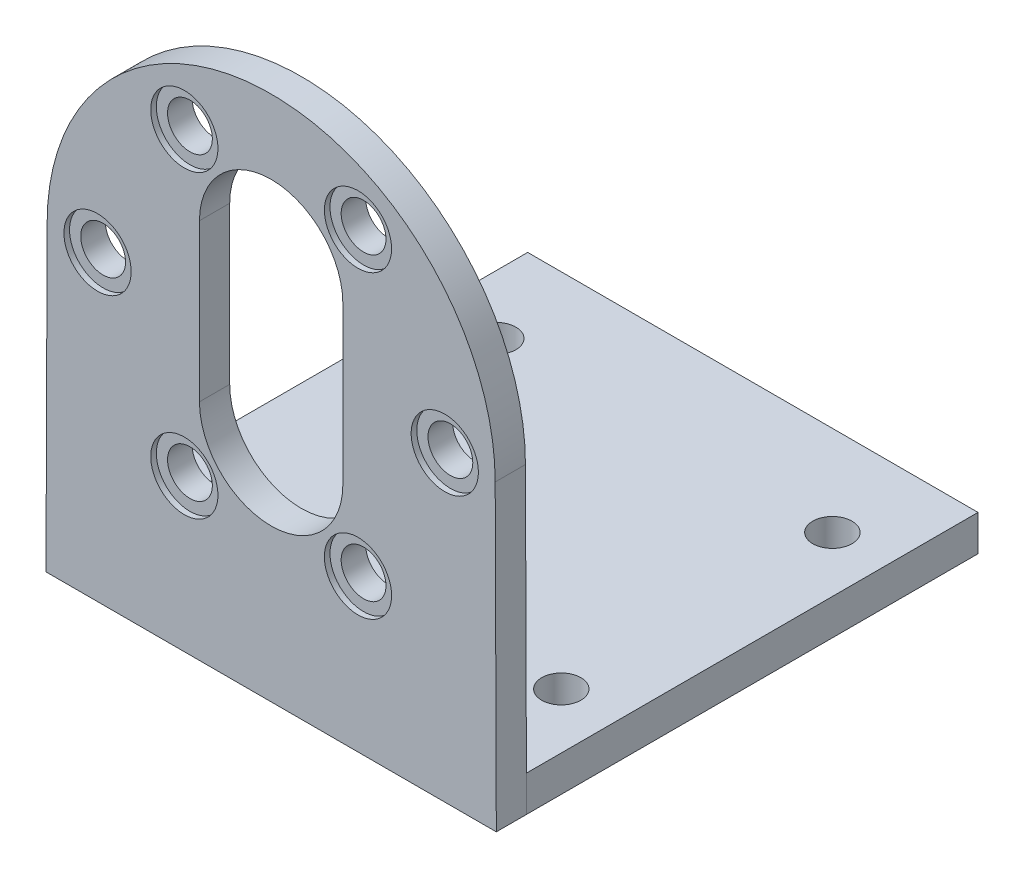
ISO-10303-21;
HEADER;
FILE_DESCRIPTION(('STEP AP214'),'2;1');
FILE_NAME('part.step','',(''),(''),'','','');
FILE_SCHEMA(('AUTOMOTIVE_DESIGN { 1 0 10303 214 1 1 1 1 }'));
ENDSEC;
DATA;
#1=APPLICATION_CONTEXT('core data for automotive mechanical design processes');
#2=APPLICATION_PROTOCOL_DEFINITION('international standard','automotive_design',2000,#1);
#3=PRODUCT_CONTEXT('',#1,'mechanical');
#4=PRODUCT('Part','Part','',(#3));
#5=PRODUCT_RELATED_PRODUCT_CATEGORY('part','',(#4));
#6=PRODUCT_DEFINITION_FORMATION('','',#4);
#7=PRODUCT_DEFINITION_CONTEXT('part definition',#1,'design');
#8=PRODUCT_DEFINITION('design','',#6,#7);
#9=PRODUCT_DEFINITION_SHAPE('','',#8);
#10=(LENGTH_UNIT() NAMED_UNIT(*) SI_UNIT(.MILLI.,.METRE.));
#11=(NAMED_UNIT(*) PLANE_ANGLE_UNIT() SI_UNIT($,.RADIAN.));
#12=(NAMED_UNIT(*) SI_UNIT($,.STERADIAN.) SOLID_ANGLE_UNIT());
#13=UNCERTAINTY_MEASURE_WITH_UNIT(LENGTH_MEASURE(1.E-05),#10,'distance_accuracy_value','');
#14=(GEOMETRIC_REPRESENTATION_CONTEXT(3) GLOBAL_UNCERTAINTY_ASSIGNED_CONTEXT((#13)) GLOBAL_UNIT_ASSIGNED_CONTEXT((#10,
#11,#12)) REPRESENTATION_CONTEXT('',''));
#15=CARTESIAN_POINT('',(0.,0.,0.));
#16=DIRECTION('',(0.,0.,1.));
#17=DIRECTION('',(1.,0.,0.));
#18=AXIS2_PLACEMENT_3D('',#15,#16,#17);
#19=CARTESIAN_POINT('',(-7.75,40.4,18.3));
#20=DIRECTION('',(0.,0.,1.));
#21=DIRECTION('',(1.,0.,0.));
#22=AXIS2_PLACEMENT_3D('',#19,#20,#21);
#23=CYLINDRICAL_SURFACE('',#22,2.);
#24=CARTESIAN_POINT('',(-7.75,40.4,18.8));
#25=DIRECTION('',(0.,0.,1.));
#26=DIRECTION('',(1.,0.,0.));
#27=AXIS2_PLACEMENT_3D('',#24,#25,#26);
#28=CIRCLE('',#27,2.);
#29=CARTESIAN_POINT('',(-5.75,40.4,18.8));
#30=VERTEX_POINT('',#29);
#31=EDGE_CURVE('E241',#30,#30,#28,.T.);
#32=ORIENTED_EDGE('',*,*,#31,.F.);
#33=EDGE_LOOP('',(#32));
#34=FACE_BOUND('',#33,.T.);
#35=CARTESIAN_POINT('',(-7.75,40.4,21.));
#36=DIRECTION('',(0.,0.,1.));
#37=DIRECTION('',(1.,0.,0.));
#38=AXIS2_PLACEMENT_3D('',#35,#36,#37);
#39=CIRCLE('',#38,2.);
#40=CARTESIAN_POINT('',(-5.75,40.4,21.));
#41=VERTEX_POINT('',#40);
#42=EDGE_CURVE('E38',#41,#41,#39,.F.);
#43=ORIENTED_EDGE('',*,*,#42,.F.);
#44=EDGE_LOOP('',(#43));
#45=FACE_BOUND('',#44,.T.);
#46=ADVANCED_FACE('F34',(#34,#45),#23,.F.);
#47=CARTESIAN_POINT('',(7.75,13.6,18.3));
#48=DIRECTION('',(0.,0.,1.));
#49=DIRECTION('',(1.,0.,0.));
#50=AXIS2_PLACEMENT_3D('',#47,#48,#49);
#51=CYLINDRICAL_SURFACE('',#50,2.);
#52=CARTESIAN_POINT('',(7.75,13.6,18.8));
#53=DIRECTION('',(0.,0.,1.));
#54=DIRECTION('',(1.,0.,0.));
#55=AXIS2_PLACEMENT_3D('',#52,#53,#54);
#56=CIRCLE('',#55,2.);
#57=CARTESIAN_POINT('',(9.75,13.6,18.8));
#58=VERTEX_POINT('',#57);
#59=EDGE_CURVE('E244',#58,#58,#56,.T.);
#60=ORIENTED_EDGE('',*,*,#59,.F.);
#61=EDGE_LOOP('',(#60));
#62=FACE_BOUND('',#61,.T.);
#63=CARTESIAN_POINT('',(7.75,13.6,21.));
#64=DIRECTION('',(0.,0.,1.));
#65=DIRECTION('',(1.,0.,0.));
#66=AXIS2_PLACEMENT_3D('',#63,#64,#65);
#67=CIRCLE('',#66,2.);
#68=CARTESIAN_POINT('',(9.75,13.6,21.));
#69=VERTEX_POINT('',#68);
#70=EDGE_CURVE('E271',#69,#69,#67,.F.);
#71=ORIENTED_EDGE('',*,*,#70,.F.);
#72=EDGE_LOOP('',(#71));
#73=FACE_BOUND('',#72,.T.);
#74=ADVANCED_FACE('F281',(#62,#73),#51,.F.);
#75=CARTESIAN_POINT('',(7.75,40.4,18.3));
#76=DIRECTION('',(0.,0.,1.));
#77=DIRECTION('',(1.,0.,0.));
#78=AXIS2_PLACEMENT_3D('',#75,#76,#77);
#79=CYLINDRICAL_SURFACE('',#78,2.);
#80=CARTESIAN_POINT('',(7.75,40.4,18.8));
#81=DIRECTION('',(0.,0.,1.));
#82=DIRECTION('',(1.,0.,0.));
#83=AXIS2_PLACEMENT_3D('',#80,#81,#82);
#84=CIRCLE('',#83,2.);
#85=CARTESIAN_POINT('',(9.75,40.4,18.8));
#86=VERTEX_POINT('',#85);
#87=EDGE_CURVE('E247',#86,#86,#84,.T.);
#88=ORIENTED_EDGE('',*,*,#87,.F.);
#89=EDGE_LOOP('',(#88));
#90=FACE_BOUND('',#89,.T.);
#91=CARTESIAN_POINT('',(7.75,40.4,21.));
#92=DIRECTION('',(0.,0.,1.));
#93=DIRECTION('',(1.,0.,0.));
#94=AXIS2_PLACEMENT_3D('',#91,#92,#93);
#95=CIRCLE('',#94,2.);
#96=CARTESIAN_POINT('',(9.75,40.4,21.));
#97=VERTEX_POINT('',#96);
#98=EDGE_CURVE('E269',#97,#97,#95,.F.);
#99=ORIENTED_EDGE('',*,*,#98,.F.);
#100=EDGE_LOOP('',(#99));
#101=FACE_BOUND('',#100,.T.);
#102=ADVANCED_FACE('F287',(#90,#101),#79,.F.);
#103=CARTESIAN_POINT('',(-15.5,27.,18.3));
#104=DIRECTION('',(0.,0.,1.));
#105=DIRECTION('',(1.,0.,0.));
#106=AXIS2_PLACEMENT_3D('',#103,#104,#105);
#107=CYLINDRICAL_SURFACE('',#106,2.);
#108=CARTESIAN_POINT('',(-15.5,27.,18.8));
#109=DIRECTION('',(0.,0.,1.));
#110=DIRECTION('',(1.,0.,0.));
#111=AXIS2_PLACEMENT_3D('',#108,#109,#110);
#112=CIRCLE('',#111,2.);
#113=CARTESIAN_POINT('',(-13.5,27.,18.8));
#114=VERTEX_POINT('',#113);
#115=EDGE_CURVE('E250',#114,#114,#112,.T.);
#116=ORIENTED_EDGE('',*,*,#115,.F.);
#117=EDGE_LOOP('',(#116));
#118=FACE_BOUND('',#117,.T.);
#119=CARTESIAN_POINT('',(-15.5,27.,21.));
#120=DIRECTION('',(0.,0.,1.));
#121=DIRECTION('',(1.,0.,0.));
#122=AXIS2_PLACEMENT_3D('',#119,#120,#121);
#123=CIRCLE('',#122,2.);
#124=CARTESIAN_POINT('',(-13.5,27.,21.));
#125=VERTEX_POINT('',#124);
#126=EDGE_CURVE('E266',#125,#125,#123,.F.);
#127=ORIENTED_EDGE('',*,*,#126,.F.);
#128=EDGE_LOOP('',(#127));
#129=FACE_BOUND('',#128,.T.);
#130=ADVANCED_FACE('F293',(#118,#129),#107,.F.);
#131=CARTESIAN_POINT('',(15.5,27.,18.3));
#132=DIRECTION('',(0.,0.,1.));
#133=DIRECTION('',(1.,0.,0.));
#134=AXIS2_PLACEMENT_3D('',#131,#132,#133);
#135=CYLINDRICAL_SURFACE('',#134,2.);
#136=CARTESIAN_POINT('',(15.5,27.,18.8));
#137=DIRECTION('',(0.,0.,1.));
#138=DIRECTION('',(1.,0.,0.));
#139=AXIS2_PLACEMENT_3D('',#136,#137,#138);
#140=CIRCLE('',#139,2.);
#141=CARTESIAN_POINT('',(17.5,27.,18.8));
#142=VERTEX_POINT('',#141);
#143=EDGE_CURVE('E253',#142,#142,#140,.T.);
#144=ORIENTED_EDGE('',*,*,#143,.F.);
#145=EDGE_LOOP('',(#144));
#146=FACE_BOUND('',#145,.T.);
#147=CARTESIAN_POINT('',(15.5,27.,21.));
#148=DIRECTION('',(0.,0.,1.));
#149=DIRECTION('',(1.,0.,0.));
#150=AXIS2_PLACEMENT_3D('',#147,#148,#149);
#151=CIRCLE('',#150,2.);
#152=CARTESIAN_POINT('',(17.5,27.,21.));
#153=VERTEX_POINT('',#152);
#154=EDGE_CURVE('E262',#153,#153,#151,.F.);
#155=ORIENTED_EDGE('',*,*,#154,.F.);
#156=EDGE_LOOP('',(#155));
#157=FACE_BOUND('',#156,.T.);
#158=ADVANCED_FACE('F464',(#146,#157),#135,.F.);
#159=CARTESIAN_POINT('',(-7.75,13.6,18.3));
#160=DIRECTION('',(0.,0.,1.));
#161=DIRECTION('',(1.,0.,0.));
#162=AXIS2_PLACEMENT_3D('',#159,#160,#161);
#163=CYLINDRICAL_SURFACE('',#162,2.);
#164=CARTESIAN_POINT('',(-7.75,13.6,18.8));
#165=DIRECTION('',(0.,0.,1.));
#166=DIRECTION('',(1.,0.,0.));
#167=AXIS2_PLACEMENT_3D('',#164,#165,#166);
#168=CIRCLE('',#167,2.);
#169=CARTESIAN_POINT('',(-5.75,13.6,18.8));
#170=VERTEX_POINT('',#169);
#171=EDGE_CURVE('E256',#170,#170,#168,.T.);
#172=ORIENTED_EDGE('',*,*,#171,.F.);
#173=EDGE_LOOP('',(#172));
#174=FACE_BOUND('',#173,.T.);
#175=CARTESIAN_POINT('',(-7.75,13.6,21.));
#176=DIRECTION('',(0.,0.,1.));
#177=DIRECTION('',(1.,0.,0.));
#178=AXIS2_PLACEMENT_3D('',#175,#176,#177);
#179=CIRCLE('',#178,2.);
#180=CARTESIAN_POINT('',(-5.75,13.6,21.));
#181=VERTEX_POINT('',#180);
#182=EDGE_CURVE('E259',#181,#181,#179,.F.);
#183=ORIENTED_EDGE('',*,*,#182,.F.);
#184=EDGE_LOOP('',(#183));
#185=FACE_BOUND('',#184,.T.);
#186=ADVANCED_FACE('F364',(#174,#185),#163,.F.);
#187=CARTESIAN_POINT('',(-20.1,3.2,-21.5));
#188=DIRECTION('',(1.,0.,0.));
#189=DIRECTION('',(0.,0.,-1.));
#190=AXIS2_PLACEMENT_3D('',#187,#188,#189);
#191=PLANE('',#190);
#192=DIRECTION('',(0.,-1.,0.));
#193=VECTOR('',#192,1.);
#194=CARTESIAN_POINT('',(-20.1,3.2,18.8));
#195=LINE('',#194,#193);
#196=CARTESIAN_POINT('',(-20.1,3.2,18.8));
#197=VERTEX_POINT('',#196);
#198=CARTESIAN_POINT('',(-20.1,0.,18.8));
#199=VERTEX_POINT('',#198);
#200=EDGE_CURVE('E204',#197,#199,#195,.T.);
#201=ORIENTED_EDGE('',*,*,#200,.F.);
#202=DIRECTION('',(0.,0.,1.));
#203=VECTOR('',#202,1.);
#204=CARTESIAN_POINT('',(-20.1,3.2,-21.5));
#205=LINE('',#204,#203);
#206=CARTESIAN_POINT('',(-20.1,3.2,-21.5));
#207=VERTEX_POINT('',#206);
#208=EDGE_CURVE('E213',#207,#197,#205,.T.);
#209=ORIENTED_EDGE('',*,*,#208,.F.);
#210=DIRECTION('',(0.,-1.,0.));
#211=VECTOR('',#210,1.);
#212=CARTESIAN_POINT('',(-20.1,3.2,-21.5));
#213=LINE('',#212,#211);
#214=CARTESIAN_POINT('',(-20.1,0.,-21.5));
#215=VERTEX_POINT('',#214);
#216=EDGE_CURVE('E221',#207,#215,#213,.T.);
#217=ORIENTED_EDGE('',*,*,#216,.T.);
#218=DIRECTION('',(0.,0.,1.));
#219=VECTOR('',#218,1.);
#220=CARTESIAN_POINT('',(-20.1,0.,-21.5));
#221=LINE('',#220,#219);
#222=EDGE_CURVE('E212',#215,#199,#221,.T.);
#223=ORIENTED_EDGE('',*,*,#222,.T.);
#224=EDGE_LOOP('',(#201,#209,#217,#223));
#225=FACE_BOUND('',#224,.T.);
#226=ADVANCED_FACE('F36',(#225),#191,.F.);
#227=CARTESIAN_POINT('',(-20.1,3.2,21.5));
#228=DIRECTION('',(0.,0.,-1.));
#229=DIRECTION('',(-1.,0.,0.));
#230=AXIS2_PLACEMENT_3D('',#227,#228,#229);
#231=PLANE('',#230);
#232=CARTESIAN_POINT('',(-7.75,13.6,21.5));
#233=DIRECTION('',(0.,0.,1.));
#234=DIRECTION('',(1.,0.,0.));
#235=AXIS2_PLACEMENT_3D('',#232,#233,#234);
#236=CIRCLE('',#235,3.);
#237=CARTESIAN_POINT('',(-4.75,13.6,21.5));
#238=VERTEX_POINT('',#237);
#239=EDGE_CURVE('E369',#238,#238,#236,.T.);
#240=ORIENTED_EDGE('',*,*,#239,.F.);
#241=EDGE_LOOP('',(#240));
#242=FACE_BOUND('',#241,.T.);
#243=CARTESIAN_POINT('',(15.5,27.,21.5));
#244=DIRECTION('',(0.,0.,1.));
#245=DIRECTION('',(1.,0.,0.));
#246=AXIS2_PLACEMENT_3D('',#243,#244,#245);
#247=CIRCLE('',#246,3.);
#248=CARTESIAN_POINT('',(18.5,27.,21.5));
#249=VERTEX_POINT('',#248);
#250=EDGE_CURVE('E373',#249,#249,#247,.T.);
#251=ORIENTED_EDGE('',*,*,#250,.F.);
#252=EDGE_LOOP('',(#251));
#253=FACE_BOUND('',#252,.T.);
#254=CARTESIAN_POINT('',(-15.5,27.,21.5));
#255=DIRECTION('',(0.,0.,1.));
#256=DIRECTION('',(1.,0.,0.));
#257=AXIS2_PLACEMENT_3D('',#254,#255,#256);
#258=CIRCLE('',#257,3.);
#259=CARTESIAN_POINT('',(-12.5,27.,21.5));
#260=VERTEX_POINT('',#259);
#261=EDGE_CURVE('E377',#260,#260,#258,.T.);
#262=ORIENTED_EDGE('',*,*,#261,.F.);
#263=EDGE_LOOP('',(#262));
#264=FACE_BOUND('',#263,.T.);
#265=CARTESIAN_POINT('',(7.75,40.4,21.5));
#266=DIRECTION('',(0.,0.,1.));
#267=DIRECTION('',(1.,0.,0.));
#268=AXIS2_PLACEMENT_3D('',#265,#266,#267);
#269=CIRCLE('',#268,3.);
#270=CARTESIAN_POINT('',(10.75,40.4,21.5));
#271=VERTEX_POINT('',#270);
#272=EDGE_CURVE('E381',#271,#271,#269,.T.);
#273=ORIENTED_EDGE('',*,*,#272,.F.);
#274=EDGE_LOOP('',(#273));
#275=FACE_BOUND('',#274,.T.);
#276=CARTESIAN_POINT('',(7.75,13.6,21.5));
#277=DIRECTION('',(0.,0.,1.));
#278=DIRECTION('',(1.,0.,0.));
#279=AXIS2_PLACEMENT_3D('',#276,#277,#278);
#280=CIRCLE('',#279,3.);
#281=CARTESIAN_POINT('',(10.75,13.6,21.5));
#282=VERTEX_POINT('',#281);
#283=EDGE_CURVE('E385',#282,#282,#280,.T.);
#284=ORIENTED_EDGE('',*,*,#283,.F.);
#285=EDGE_LOOP('',(#284));
#286=FACE_BOUND('',#285,.T.);
#287=CARTESIAN_POINT('',(-7.75,40.4,21.5));
#288=DIRECTION('',(0.,0.,1.));
#289=DIRECTION('',(1.,0.,0.));
#290=AXIS2_PLACEMENT_3D('',#287,#288,#289);
#291=CIRCLE('',#290,3.);
#292=CARTESIAN_POINT('',(-4.75,40.4,21.5));
#293=VERTEX_POINT('',#292);
#294=EDGE_CURVE('E388',#293,#293,#291,.T.);
#295=ORIENTED_EDGE('',*,*,#294,.F.);
#296=EDGE_LOOP('',(#295));
#297=FACE_BOUND('',#296,.T.);
#298=DIRECTION('',(0.,-1.,0.));
#299=VECTOR('',#298,1.);
#300=CARTESIAN_POINT('',(-6.4,34.,21.5));
#301=LINE('',#300,#299);
#302=CARTESIAN_POINT('',(-6.4,34.,21.5));
#303=VERTEX_POINT('',#302);
#304=CARTESIAN_POINT('',(-6.4,20.,21.5));
#305=VERTEX_POINT('',#304);
#306=EDGE_CURVE('E137',#303,#305,#301,.T.);
#307=ORIENTED_EDGE('',*,*,#306,.F.);
#308=CARTESIAN_POINT('',(0.,34.,21.5));
#309=DIRECTION('',(0.,0.,1.));
#310=DIRECTION('',(1.,0.,0.));
#311=AXIS2_PLACEMENT_3D('',#308,#309,#310);
#312=CIRCLE('',#311,6.4);
#313=CARTESIAN_POINT('',(6.4,34.,21.5));
#314=VERTEX_POINT('',#313);
#315=EDGE_CURVE('E51',#314,#303,#312,.T.);
#316=ORIENTED_EDGE('',*,*,#315,.F.);
#317=DIRECTION('',(0.,1.,0.));
#318=VECTOR('',#317,1.);
#319=CARTESIAN_POINT('',(6.4,34.,21.5));
#320=LINE('',#319,#318);
#321=CARTESIAN_POINT('',(6.4,20.,21.5));
#322=VERTEX_POINT('',#321);
#323=EDGE_CURVE('E144',#322,#314,#320,.T.);
#324=ORIENTED_EDGE('',*,*,#323,.F.);
#325=CARTESIAN_POINT('',(0.,20.,21.5));
#326=DIRECTION('',(0.,0.,1.));
#327=DIRECTION('',(1.,0.,0.));
#328=AXIS2_PLACEMENT_3D('',#325,#326,#327);
#329=CIRCLE('',#328,6.4);
#330=EDGE_CURVE('E128',#305,#322,#329,.T.);
#331=ORIENTED_EDGE('',*,*,#330,.F.);
#332=EDGE_LOOP('',(#307,#316,#324,#331));
#333=FACE_BOUND('',#332,.T.);
#334=DIRECTION('',(-0.00370367830133331,-0.99999314136,0.));
#335=VECTOR('',#334,1.);
#336=CARTESIAN_POINT('',(-20.,27.,21.5));
#337=LINE('',#336,#335);
#338=CARTESIAN_POINT('',(-20.,27.,21.5));
#339=VERTEX_POINT('',#338);
#340=CARTESIAN_POINT('',(-20.1,0.,21.5));
#341=VERTEX_POINT('',#340);
#342=EDGE_CURVE('E192',#339,#341,#337,.T.);
#343=ORIENTED_EDGE('',*,*,#342,.T.);
#344=DIRECTION('',(1.,0.,0.));
#345=VECTOR('',#344,1.);
#346=CARTESIAN_POINT('',(-20.1,0.,21.5));
#347=LINE('',#346,#345);
#348=CARTESIAN_POINT('',(20.1,0.,21.5));
#349=VERTEX_POINT('',#348);
#350=EDGE_CURVE('E224',#341,#349,#347,.T.);
#351=ORIENTED_EDGE('',*,*,#350,.T.);
#352=DIRECTION('',(-0.00370367830133331,0.99999314136,0.));
#353=VECTOR('',#352,1.);
#354=CARTESIAN_POINT('',(20.1,0.,21.5));
#355=LINE('',#354,#353);
#356=CARTESIAN_POINT('',(20.,27.,21.5));
#357=VERTEX_POINT('',#356);
#358=EDGE_CURVE('E175',#349,#357,#355,.T.);
#359=ORIENTED_EDGE('',*,*,#358,.T.);
#360=CARTESIAN_POINT('',(0.,27.,21.5));
#361=DIRECTION('',(0.,0.,1.));
#362=DIRECTION('',(1.,0.,0.));
#363=AXIS2_PLACEMENT_3D('',#360,#361,#362);
#364=CIRCLE('',#363,20.);
#365=EDGE_CURVE('E190',#357,#339,#364,.T.);
#366=ORIENTED_EDGE('',*,*,#365,.T.);
#367=EDGE_LOOP('',(#343,#351,#359,#366));
#368=FACE_BOUND('',#367,.T.);
#369=ADVANCED_FACE('F141',(#242,#253,#264,#275,#286,#297,#333,#368),#231,.F.);
#370=CARTESIAN_POINT('',(20.1,3.2,-21.5));
#371=DIRECTION('',(-1.,0.,0.));
#372=DIRECTION('',(0.,0.,1.));
#373=AXIS2_PLACEMENT_3D('',#370,#371,#372);
#374=PLANE('',#373);
#375=DIRECTION('',(0.,1.,0.));
#376=VECTOR('',#375,1.);
#377=CARTESIAN_POINT('',(20.1,3.2,18.8));
#378=LINE('',#377,#376);
#379=CARTESIAN_POINT('',(20.1,0.,18.8));
#380=VERTEX_POINT('',#379);
#381=CARTESIAN_POINT('',(20.1,3.2,18.8));
#382=VERTEX_POINT('',#381);
#383=EDGE_CURVE('E197',#380,#382,#378,.T.);
#384=ORIENTED_EDGE('',*,*,#383,.F.);
#385=DIRECTION('',(0.,0.,-1.));
#386=VECTOR('',#385,1.);
#387=CARTESIAN_POINT('',(20.1,0.,-21.5));
#388=LINE('',#387,#386);
#389=CARTESIAN_POINT('',(20.1,0.,-21.5));
#390=VERTEX_POINT('',#389);
#391=EDGE_CURVE('E227',#380,#390,#388,.T.);
#392=ORIENTED_EDGE('',*,*,#391,.T.);
#393=DIRECTION('',(0.,-1.,0.));
#394=VECTOR('',#393,1.);
#395=CARTESIAN_POINT('',(20.1,3.2,-21.5));
#396=LINE('',#395,#394);
#397=CARTESIAN_POINT('',(20.1,3.2,-21.5));
#398=VERTEX_POINT('',#397);
#399=EDGE_CURVE('E233',#398,#390,#396,.T.);
#400=ORIENTED_EDGE('',*,*,#399,.F.);
#401=DIRECTION('',(0.,0.,-1.));
#402=VECTOR('',#401,1.);
#403=CARTESIAN_POINT('',(20.1,3.2,-21.5));
#404=LINE('',#403,#402);
#405=EDGE_CURVE('E216',#382,#398,#404,.T.);
#406=ORIENTED_EDGE('',*,*,#405,.F.);
#407=EDGE_LOOP('',(#384,#392,#400,#406));
#408=FACE_BOUND('',#407,.T.);
#409=ADVANCED_FACE('F345',(#408),#374,.F.);
#410=CARTESIAN_POINT('',(-20.1,47.,18.8));
#411=DIRECTION('',(0.,0.,1.));
#412=DIRECTION('',(1.,0.,0.));
#413=AXIS2_PLACEMENT_3D('',#410,#411,#412);
#414=PLANE('',#413);
#415=ORIENTED_EDGE('',*,*,#171,.T.);
#416=EDGE_LOOP('',(#415));
#417=FACE_BOUND('',#416,.T.);
#418=ORIENTED_EDGE('',*,*,#143,.T.);
#419=EDGE_LOOP('',(#418));
#420=FACE_BOUND('',#419,.T.);
#421=ORIENTED_EDGE('',*,*,#115,.T.);
#422=EDGE_LOOP('',(#421));
#423=FACE_BOUND('',#422,.T.);
#424=ORIENTED_EDGE('',*,*,#87,.T.);
#425=EDGE_LOOP('',(#424));
#426=FACE_BOUND('',#425,.T.);
#427=ORIENTED_EDGE('',*,*,#59,.T.);
#428=EDGE_LOOP('',(#427));
#429=FACE_BOUND('',#428,.T.);
#430=ORIENTED_EDGE('',*,*,#31,.T.);
#431=EDGE_LOOP('',(#430));
#432=FACE_BOUND('',#431,.T.);
#433=DIRECTION('',(0.,1.,0.));
#434=VECTOR('',#433,1.);
#435=CARTESIAN_POINT('',(6.4,47.,18.8));
#436=LINE('',#435,#434);
#437=CARTESIAN_POINT('',(6.4,20.,18.8));
#438=VERTEX_POINT('',#437);
#439=CARTESIAN_POINT('',(6.4,34.,18.8));
#440=VERTEX_POINT('',#439);
#441=EDGE_CURVE('E43',#438,#440,#436,.T.);
#442=ORIENTED_EDGE('',*,*,#441,.T.);
#443=CARTESIAN_POINT('',(0.,34.,18.8));
#444=DIRECTION('',(0.,0.,1.));
#445=DIRECTION('',(1.,0.,0.));
#446=AXIS2_PLACEMENT_3D('',#443,#444,#445);
#447=CIRCLE('',#446,6.4);
#448=CARTESIAN_POINT('',(-6.4,34.,18.8));
#449=VERTEX_POINT('',#448);
#450=EDGE_CURVE('E12',#440,#449,#447,.T.);
#451=ORIENTED_EDGE('',*,*,#450,.T.);
#452=DIRECTION('',(0.,-1.,0.));
#453=VECTOR('',#452,1.);
#454=CARTESIAN_POINT('',(-6.4,47.,18.8));
#455=LINE('',#454,#453);
#456=CARTESIAN_POINT('',(-6.4,20.,18.8));
#457=VERTEX_POINT('',#456);
#458=EDGE_CURVE('E236',#449,#457,#455,.T.);
#459=ORIENTED_EDGE('',*,*,#458,.T.);
#460=CARTESIAN_POINT('',(0.,20.,18.8));
#461=DIRECTION('',(0.,0.,1.));
#462=DIRECTION('',(1.,0.,0.));
#463=AXIS2_PLACEMENT_3D('',#460,#461,#462);
#464=CIRCLE('',#463,6.4);
#465=EDGE_CURVE('E131',#457,#438,#464,.T.);
#466=ORIENTED_EDGE('',*,*,#465,.T.);
#467=EDGE_LOOP('',(#442,#451,#459,#466));
#468=FACE_BOUND('',#467,.T.);
#469=DIRECTION('',(-0.00370367830133331,-0.99999314136,0.));
#470=VECTOR('',#469,1.);
#471=CARTESIAN_POINT('',(-20.,27.,18.8));
#472=LINE('',#471,#470);
#473=CARTESIAN_POINT('',(-20.,27.,18.8));
#474=VERTEX_POINT('',#473);
#475=CARTESIAN_POINT('',(-20.0881481481481,3.2,18.8));
#476=VERTEX_POINT('',#475);
#477=EDGE_CURVE('E184',#474,#476,#472,.T.);
#478=ORIENTED_EDGE('',*,*,#477,.F.);
#479=CARTESIAN_POINT('',(0.,27.,18.8));
#480=DIRECTION('',(0.,0.,1.));
#481=DIRECTION('',(1.,0.,0.));
#482=AXIS2_PLACEMENT_3D('',#479,#480,#481);
#483=CIRCLE('',#482,20.);
#484=CARTESIAN_POINT('',(20.,27.,18.8));
#485=VERTEX_POINT('',#484);
#486=EDGE_CURVE('E180',#485,#474,#483,.T.);
#487=ORIENTED_EDGE('',*,*,#486,.F.);
#488=DIRECTION('',(-0.00370367830133331,0.99999314136,0.));
#489=VECTOR('',#488,1.);
#490=CARTESIAN_POINT('',(20.1,0.,18.8));
#491=LINE('',#490,#489);
#492=CARTESIAN_POINT('',(20.0881481481482,3.2,18.8));
#493=VERTEX_POINT('',#492);
#494=EDGE_CURVE('E181',#493,#485,#491,.T.);
#495=ORIENTED_EDGE('',*,*,#494,.F.);
#496=DIRECTION('',(-1.,0.,0.));
#497=VECTOR('',#496,1.);
#498=CARTESIAN_POINT('',(-20.1,3.2,18.8));
#499=LINE('',#498,#497);
#500=EDGE_CURVE('E206',#493,#476,#499,.T.);
#501=ORIENTED_EDGE('',*,*,#500,.T.);
#502=EDGE_LOOP('',(#478,#487,#495,#501));
#503=FACE_BOUND('',#502,.T.);
#504=ADVANCED_FACE('F341',(#417,#420,#423,#426,#429,#432,#468,#503),#414,.F.);
#505=CARTESIAN_POINT('',(-20.1,3.2,-21.5));
#506=DIRECTION('',(0.,0.,1.));
#507=DIRECTION('',(1.,0.,0.));
#508=AXIS2_PLACEMENT_3D('',#505,#506,#507);
#509=PLANE('',#508);
#510=DIRECTION('',(-1.,0.,0.));
#511=VECTOR('',#510,1.);
#512=CARTESIAN_POINT('',(-20.1,0.,-21.5));
#513=LINE('',#512,#511);
#514=EDGE_CURVE('E217',#390,#215,#513,.T.);
#515=ORIENTED_EDGE('',*,*,#514,.T.);
#516=ORIENTED_EDGE('',*,*,#216,.F.);
#517=DIRECTION('',(-1.,0.,0.));
#518=VECTOR('',#517,1.);
#519=CARTESIAN_POINT('',(-20.1,3.2,-21.5));
#520=LINE('',#519,#518);
#521=EDGE_CURVE('E219',#398,#207,#520,.T.);
#522=ORIENTED_EDGE('',*,*,#521,.F.);
#523=ORIENTED_EDGE('',*,*,#399,.T.);
#524=EDGE_LOOP('',(#515,#516,#522,#523));
#525=FACE_BOUND('',#524,.T.);
#526=ADVANCED_FACE('F344',(#525),#509,.F.);
#527=CARTESIAN_POINT('',(0.,3.2,0.));
#528=DIRECTION('',(0.,1.,0.));
#529=DIRECTION('',(0.,0.,1.));
#530=AXIS2_PLACEMENT_3D('',#527,#528,#529);
#531=PLANE('',#530);
#532=CARTESIAN_POINT('',(15.15,3.2,-13.45));
#533=DIRECTION('',(0.,1.,0.));
#534=DIRECTION('',(0.,0.,1.));
#535=AXIS2_PLACEMENT_3D('',#532,#533,#534);
#536=CIRCLE('',#535,1.75);
#537=CARTESIAN_POINT('',(15.15,3.2,-11.7));
#538=VERTEX_POINT('',#537);
#539=EDGE_CURVE('E151',#538,#538,#536,.T.);
#540=ORIENTED_EDGE('',*,*,#539,.F.);
#541=EDGE_LOOP('',(#540));
#542=FACE_BOUND('',#541,.T.);
#543=CARTESIAN_POINT('',(-14.85,3.2,10.75));
#544=DIRECTION('',(0.,1.,0.));
#545=DIRECTION('',(0.,0.,1.));
#546=AXIS2_PLACEMENT_3D('',#543,#544,#545);
#547=CIRCLE('',#546,1.75);
#548=CARTESIAN_POINT('',(-14.85,3.2,12.5));
#549=VERTEX_POINT('',#548);
#550=EDGE_CURVE('E164',#549,#549,#547,.T.);
#551=ORIENTED_EDGE('',*,*,#550,.F.);
#552=EDGE_LOOP('',(#551));
#553=FACE_BOUND('',#552,.T.);
#554=CARTESIAN_POINT('',(15.15,3.2,10.75));
#555=DIRECTION('',(0.,1.,0.));
#556=DIRECTION('',(0.,0.,1.));
#557=AXIS2_PLACEMENT_3D('',#554,#555,#556);
#558=CIRCLE('',#557,1.75);
#559=CARTESIAN_POINT('',(15.15,3.2,12.5));
#560=VERTEX_POINT('',#559);
#561=EDGE_CURVE('E158',#560,#560,#558,.T.);
#562=ORIENTED_EDGE('',*,*,#561,.F.);
#563=EDGE_LOOP('',(#562));
#564=FACE_BOUND('',#563,.T.);
#565=CARTESIAN_POINT('',(-14.85,3.2,-13.45));
#566=DIRECTION('',(0.,1.,0.));
#567=DIRECTION('',(0.,0.,1.));
#568=AXIS2_PLACEMENT_3D('',#565,#566,#567);
#569=CIRCLE('',#568,1.75);
#570=CARTESIAN_POINT('',(-14.85,3.2,-11.7));
#571=VERTEX_POINT('',#570);
#572=EDGE_CURVE('E157',#571,#571,#569,.T.);
#573=ORIENTED_EDGE('',*,*,#572,.F.);
#574=EDGE_LOOP('',(#573));
#575=FACE_BOUND('',#574,.T.);
#576=EDGE_CURVE('E209',#382,#493,#499,.T.);
#577=ORIENTED_EDGE('',*,*,#576,.F.);
#578=ORIENTED_EDGE('',*,*,#405,.T.);
#579=ORIENTED_EDGE('',*,*,#521,.T.);
#580=ORIENTED_EDGE('',*,*,#208,.T.);
#581=DIRECTION('',(1.,0.,0.));
#582=VECTOR('',#581,1.);
#583=CARTESIAN_POINT('',(0.,3.2,18.8));
#584=LINE('',#583,#582);
#585=EDGE_CURVE('E203',#197,#476,#584,.T.);
#586=ORIENTED_EDGE('',*,*,#585,.T.);
#587=ORIENTED_EDGE('',*,*,#500,.F.);
#588=EDGE_LOOP('',(#577,#578,#579,#580,#586,#587));
#589=FACE_BOUND('',#588,.T.);
#590=ADVANCED_FACE('F347',(#542,#553,#564,#575,#589),#531,.T.);
#591=CARTESIAN_POINT('',(0.,0.,0.));
#592=DIRECTION('',(0.,1.,0.));
#593=DIRECTION('',(0.,0.,1.));
#594=AXIS2_PLACEMENT_3D('',#591,#592,#593);
#595=PLANE('',#594);
#596=CARTESIAN_POINT('',(15.15,0.,-13.45));
#597=DIRECTION('',(0.,1.,0.));
#598=DIRECTION('',(0.,0.,1.));
#599=AXIS2_PLACEMENT_3D('',#596,#597,#598);
#600=CIRCLE('',#599,1.75);
#601=CARTESIAN_POINT('',(15.15,0.,-11.7));
#602=VERTEX_POINT('',#601);
#603=EDGE_CURVE('E167',#602,#602,#600,.T.);
#604=ORIENTED_EDGE('',*,*,#603,.T.);
#605=EDGE_LOOP('',(#604));
#606=FACE_BOUND('',#605,.T.);
#607=CARTESIAN_POINT('',(-14.85,0.,10.75));
#608=DIRECTION('',(0.,1.,0.));
#609=DIRECTION('',(0.,0.,1.));
#610=AXIS2_PLACEMENT_3D('',#607,#608,#609);
#611=CIRCLE('',#610,1.75);
#612=CARTESIAN_POINT('',(-14.85,0.,12.5));
#613=VERTEX_POINT('',#612);
#614=EDGE_CURVE('E161',#613,#613,#611,.T.);
#615=ORIENTED_EDGE('',*,*,#614,.T.);
#616=EDGE_LOOP('',(#615));
#617=FACE_BOUND('',#616,.T.);
#618=CARTESIAN_POINT('',(15.15,0.,10.75));
#619=DIRECTION('',(0.,1.,0.));
#620=DIRECTION('',(0.,0.,1.));
#621=AXIS2_PLACEMENT_3D('',#618,#619,#620);
#622=CIRCLE('',#621,1.75);
#623=CARTESIAN_POINT('',(15.15,0.,12.5));
#624=VERTEX_POINT('',#623);
#625=EDGE_CURVE('E154',#624,#624,#622,.T.);
#626=ORIENTED_EDGE('',*,*,#625,.T.);
#627=EDGE_LOOP('',(#626));
#628=FACE_BOUND('',#627,.T.);
#629=CARTESIAN_POINT('',(-14.85,0.,-13.45));
#630=DIRECTION('',(0.,1.,0.));
#631=DIRECTION('',(0.,0.,1.));
#632=AXIS2_PLACEMENT_3D('',#629,#630,#631);
#633=CIRCLE('',#632,1.75);
#634=CARTESIAN_POINT('',(-14.85,0.,-11.7));
#635=VERTEX_POINT('',#634);
#636=EDGE_CURVE('E172',#635,#635,#633,.T.);
#637=ORIENTED_EDGE('',*,*,#636,.T.);
#638=EDGE_LOOP('',(#637));
#639=FACE_BOUND('',#638,.T.);
#640=DIRECTION('',(0.,0.,1.));
#641=VECTOR('',#640,1.);
#642=CARTESIAN_POINT('',(-20.1,0.,18.8));
#643=LINE('',#642,#641);
#644=EDGE_CURVE('E195',#199,#341,#643,.T.);
#645=ORIENTED_EDGE('',*,*,#644,.F.);
#646=ORIENTED_EDGE('',*,*,#222,.F.);
#647=ORIENTED_EDGE('',*,*,#514,.F.);
#648=ORIENTED_EDGE('',*,*,#391,.F.);
#649=EDGE_CURVE('E228',#349,#380,#388,.T.);
#650=ORIENTED_EDGE('',*,*,#649,.F.);
#651=ORIENTED_EDGE('',*,*,#350,.F.);
#652=EDGE_LOOP('',(#645,#646,#647,#648,#650,#651));
#653=FACE_BOUND('',#652,.T.);
#654=ADVANCED_FACE('F339',(#606,#617,#628,#639,#653),#595,.F.);
#655=CARTESIAN_POINT('',(0.,23.5,18.8));
#656=DIRECTION('',(0.,0.,1.));
#657=DIRECTION('',(1.,0.,0.));
#658=AXIS2_PLACEMENT_3D('',#655,#656,#657);
#659=PLANE('',#658);
#660=ORIENTED_EDGE('',*,*,#200,.T.);
#661=EDGE_CURVE('E183',#476,#199,#472,.T.);
#662=ORIENTED_EDGE('',*,*,#661,.F.);
#663=ORIENTED_EDGE('',*,*,#585,.F.);
#664=EDGE_LOOP('',(#660,#662,#663));
#665=FACE_BOUND('',#664,.T.);
#666=ADVANCED_FACE('F336',(#665),#659,.T.);
#667=EDGE_CURVE('E178',#380,#493,#491,.T.);
#668=ORIENTED_EDGE('',*,*,#667,.F.);
#669=ORIENTED_EDGE('',*,*,#383,.T.);
#670=ORIENTED_EDGE('',*,*,#576,.T.);
#671=EDGE_LOOP('',(#668,#669,#670));
#672=FACE_BOUND('',#671,.T.);
#673=ADVANCED_FACE('F331',(#672),#659,.T.);
#674=CARTESIAN_POINT('',(0.,27.,18.8));
#675=DIRECTION('',(0.,0.,1.));
#676=DIRECTION('',(1.,0.,0.));
#677=AXIS2_PLACEMENT_3D('',#674,#675,#676);
#678=CYLINDRICAL_SURFACE('',#677,20.);
#679=ORIENTED_EDGE('',*,*,#486,.T.);
#680=DIRECTION('',(0.,0.,1.));
#681=VECTOR('',#680,1.);
#682=CARTESIAN_POINT('',(-20.,27.,18.8));
#683=LINE('',#682,#681);
#684=EDGE_CURVE('E198',#474,#339,#683,.T.);
#685=ORIENTED_EDGE('',*,*,#684,.T.);
#686=ORIENTED_EDGE('',*,*,#365,.F.);
#687=DIRECTION('',(0.,0.,1.));
#688=VECTOR('',#687,1.);
#689=CARTESIAN_POINT('',(20.,27.,18.8));
#690=LINE('',#689,#688);
#691=EDGE_CURVE('E187',#485,#357,#690,.T.);
#692=ORIENTED_EDGE('',*,*,#691,.F.);
#693=EDGE_LOOP('',(#679,#685,#686,#692));
#694=FACE_BOUND('',#693,.T.);
#695=ADVANCED_FACE('F327',(#694),#678,.T.);
#696=CARTESIAN_POINT('',(-20.,27.,18.8));
#697=DIRECTION('',(-0.99999314136,0.00370367830133331,0.));
#698=DIRECTION('',(-0.00370367830133331,-0.99999314136,0.));
#699=AXIS2_PLACEMENT_3D('',#696,#697,#698);
#700=PLANE('',#699);
#701=ORIENTED_EDGE('',*,*,#342,.F.);
#702=ORIENTED_EDGE('',*,*,#684,.F.);
#703=ORIENTED_EDGE('',*,*,#477,.T.);
#704=ORIENTED_EDGE('',*,*,#661,.T.);
#705=ORIENTED_EDGE('',*,*,#644,.T.);
#706=EDGE_LOOP('',(#701,#702,#703,#704,#705));
#707=FACE_BOUND('',#706,.T.);
#708=ADVANCED_FACE('F324',(#707),#700,.T.);
#709=CARTESIAN_POINT('',(20.1,0.,18.8));
#710=DIRECTION('',(0.99999314136,0.00370367830133331,0.));
#711=DIRECTION('',(-0.00370367830133331,0.99999314136,0.));
#712=AXIS2_PLACEMENT_3D('',#709,#710,#711);
#713=PLANE('',#712);
#714=ORIENTED_EDGE('',*,*,#358,.F.);
#715=ORIENTED_EDGE('',*,*,#649,.T.);
#716=ORIENTED_EDGE('',*,*,#667,.T.);
#717=ORIENTED_EDGE('',*,*,#494,.T.);
#718=ORIENTED_EDGE('',*,*,#691,.T.);
#719=EDGE_LOOP('',(#714,#715,#716,#717,#718));
#720=FACE_BOUND('',#719,.T.);
#721=ADVANCED_FACE('F322',(#720),#713,.T.);
#722=CARTESIAN_POINT('',(-14.85,0.,-13.45));
#723=DIRECTION('',(0.,1.,0.));
#724=DIRECTION('',(0.,0.,1.));
#725=AXIS2_PLACEMENT_3D('',#722,#723,#724);
#726=CYLINDRICAL_SURFACE('',#725,1.75);
#727=ORIENTED_EDGE('',*,*,#636,.F.);
#728=EDGE_LOOP('',(#727));
#729=FACE_BOUND('',#728,.T.);
#730=ORIENTED_EDGE('',*,*,#572,.T.);
#731=EDGE_LOOP('',(#730));
#732=FACE_BOUND('',#731,.T.);
#733=ADVANCED_FACE('F312',(#729,#732),#726,.F.);
#734=CARTESIAN_POINT('',(15.15,0.,10.75));
#735=DIRECTION('',(0.,1.,0.));
#736=DIRECTION('',(0.,0.,1.));
#737=AXIS2_PLACEMENT_3D('',#734,#735,#736);
#738=CYLINDRICAL_SURFACE('',#737,1.75);
#739=ORIENTED_EDGE('',*,*,#625,.F.);
#740=EDGE_LOOP('',(#739));
#741=FACE_BOUND('',#740,.T.);
#742=ORIENTED_EDGE('',*,*,#561,.T.);
#743=EDGE_LOOP('',(#742));
#744=FACE_BOUND('',#743,.T.);
#745=ADVANCED_FACE('F308',(#741,#744),#738,.F.);
#746=CARTESIAN_POINT('',(-14.85,0.,10.75));
#747=DIRECTION('',(0.,1.,0.));
#748=DIRECTION('',(0.,0.,1.));
#749=AXIS2_PLACEMENT_3D('',#746,#747,#748);
#750=CYLINDRICAL_SURFACE('',#749,1.75);
#751=ORIENTED_EDGE('',*,*,#614,.F.);
#752=EDGE_LOOP('',(#751));
#753=FACE_BOUND('',#752,.T.);
#754=ORIENTED_EDGE('',*,*,#550,.T.);
#755=EDGE_LOOP('',(#754));
#756=FACE_BOUND('',#755,.T.);
#757=ADVANCED_FACE('F311',(#753,#756),#750,.F.);
#758=CARTESIAN_POINT('',(15.15,0.,-13.45));
#759=DIRECTION('',(0.,1.,0.));
#760=DIRECTION('',(0.,0.,1.));
#761=AXIS2_PLACEMENT_3D('',#758,#759,#760);
#762=CYLINDRICAL_SURFACE('',#761,1.75);
#763=ORIENTED_EDGE('',*,*,#603,.F.);
#764=EDGE_LOOP('',(#763));
#765=FACE_BOUND('',#764,.T.);
#766=ORIENTED_EDGE('',*,*,#539,.T.);
#767=EDGE_LOOP('',(#766));
#768=FACE_BOUND('',#767,.T.);
#769=ADVANCED_FACE('F307',(#765,#768),#762,.F.);
#770=CARTESIAN_POINT('',(0.,34.,18.3));
#771=DIRECTION('',(0.,0.,1.));
#772=DIRECTION('',(1.,0.,0.));
#773=AXIS2_PLACEMENT_3D('',#770,#771,#772);
#774=CYLINDRICAL_SURFACE('',#773,6.4);
#775=DIRECTION('',(0.,0.,1.));
#776=VECTOR('',#775,1.);
#777=CARTESIAN_POINT('',(6.4,34.,18.3));
#778=LINE('',#777,#776);
#779=EDGE_CURVE('E149',#440,#314,#778,.T.);
#780=ORIENTED_EDGE('',*,*,#779,.T.);
#781=ORIENTED_EDGE('',*,*,#315,.T.);
#782=DIRECTION('',(0.,0.,1.));
#783=VECTOR('',#782,1.);
#784=CARTESIAN_POINT('',(-6.4,34.,18.3));
#785=LINE('',#784,#783);
#786=EDGE_CURVE('E134',#449,#303,#785,.T.);
#787=ORIENTED_EDGE('',*,*,#786,.F.);
#788=ORIENTED_EDGE('',*,*,#450,.F.);
#789=EDGE_LOOP('',(#780,#781,#787,#788));
#790=FACE_BOUND('',#789,.T.);
#791=ADVANCED_FACE('F298',(#790),#774,.F.);
#792=CARTESIAN_POINT('',(6.4,34.,18.3));
#793=DIRECTION('',(1.,0.,0.));
#794=DIRECTION('',(0.,1.,0.));
#795=AXIS2_PLACEMENT_3D('',#792,#793,#794);
#796=PLANE('',#795);
#797=DIRECTION('',(0.,0.,1.));
#798=VECTOR('',#797,1.);
#799=CARTESIAN_POINT('',(6.4,20.,18.3));
#800=LINE('',#799,#798);
#801=EDGE_CURVE('E133',#438,#322,#800,.T.);
#802=ORIENTED_EDGE('',*,*,#801,.T.);
#803=ORIENTED_EDGE('',*,*,#323,.T.);
#804=ORIENTED_EDGE('',*,*,#779,.F.);
#805=ORIENTED_EDGE('',*,*,#441,.F.);
#806=EDGE_LOOP('',(#802,#803,#804,#805));
#807=FACE_BOUND('',#806,.T.);
#808=ADVANCED_FACE('F295',(#807),#796,.F.);
#809=CARTESIAN_POINT('',(0.,20.,18.3));
#810=DIRECTION('',(0.,0.,1.));
#811=DIRECTION('',(1.,0.,0.));
#812=AXIS2_PLACEMENT_3D('',#809,#810,#811);
#813=CYLINDRICAL_SURFACE('',#812,6.4);
#814=DIRECTION('',(0.,0.,1.));
#815=VECTOR('',#814,1.);
#816=CARTESIAN_POINT('',(-6.4,20.,18.3));
#817=LINE('',#816,#815);
#818=EDGE_CURVE('E59',#457,#305,#817,.T.);
#819=ORIENTED_EDGE('',*,*,#818,.T.);
#820=ORIENTED_EDGE('',*,*,#330,.T.);
#821=ORIENTED_EDGE('',*,*,#801,.F.);
#822=ORIENTED_EDGE('',*,*,#465,.F.);
#823=EDGE_LOOP('',(#819,#820,#821,#822));
#824=FACE_BOUND('',#823,.T.);
#825=ADVANCED_FACE('F125',(#824),#813,.F.);
#826=CARTESIAN_POINT('',(-6.4,34.,18.3));
#827=DIRECTION('',(-1.,0.,0.));
#828=DIRECTION('',(0.,-1.,0.));
#829=AXIS2_PLACEMENT_3D('',#826,#827,#828);
#830=PLANE('',#829);
#831=ORIENTED_EDGE('',*,*,#786,.T.);
#832=ORIENTED_EDGE('',*,*,#306,.T.);
#833=ORIENTED_EDGE('',*,*,#818,.F.);
#834=ORIENTED_EDGE('',*,*,#458,.F.);
#835=EDGE_LOOP('',(#831,#832,#833,#834));
#836=FACE_BOUND('',#835,.T.);
#837=ADVANCED_FACE('F138',(#836),#830,.F.);
#838=CARTESIAN_POINT('',(-7.75,13.6,21.));
#839=DIRECTION('',(0.,0.,1.));
#840=DIRECTION('',(1.,0.,0.));
#841=AXIS2_PLACEMENT_3D('',#838,#839,#840);
#842=PLANE('',#841);
#843=CARTESIAN_POINT('',(-7.75,13.6,21.));
#844=DIRECTION('',(0.,0.,1.));
#845=DIRECTION('',(1.,0.,0.));
#846=AXIS2_PLACEMENT_3D('',#843,#844,#845);
#847=CIRCLE('',#846,3.);
#848=CARTESIAN_POINT('',(-4.75,13.6,21.));
#849=VERTEX_POINT('',#848);
#850=EDGE_CURVE('E404',#849,#849,#847,.T.);
#851=ORIENTED_EDGE('',*,*,#850,.T.);
#852=EDGE_LOOP('',(#851));
#853=FACE_BOUND('',#852,.T.);
#854=ORIENTED_EDGE('',*,*,#182,.T.);
#855=EDGE_LOOP('',(#854));
#856=FACE_BOUND('',#855,.T.);
#857=ADVANCED_FACE('F304',(#853,#856),#842,.T.);
#858=CARTESIAN_POINT('',(-7.75,13.6,21.));
#859=DIRECTION('',(0.,0.,1.));
#860=DIRECTION('',(1.,0.,0.));
#861=AXIS2_PLACEMENT_3D('',#858,#859,#860);
#862=CYLINDRICAL_SURFACE('',#861,3.);
#863=ORIENTED_EDGE('',*,*,#850,.F.);
#864=EDGE_LOOP('',(#863));
#865=FACE_BOUND('',#864,.T.);
#866=ORIENTED_EDGE('',*,*,#239,.T.);
#867=EDGE_LOOP('',(#866));
#868=FACE_BOUND('',#867,.T.);
#869=ADVANCED_FACE('F435',(#865,#868),#862,.F.);
#870=CARTESIAN_POINT('',(15.5,27.,21.));
#871=DIRECTION('',(0.,0.,1.));
#872=DIRECTION('',(1.,0.,0.));
#873=AXIS2_PLACEMENT_3D('',#870,#871,#872);
#874=PLANE('',#873);
#875=CARTESIAN_POINT('',(15.5,27.,21.));
#876=DIRECTION('',(0.,0.,1.));
#877=DIRECTION('',(1.,0.,0.));
#878=AXIS2_PLACEMENT_3D('',#875,#876,#877);
#879=CIRCLE('',#878,3.);
#880=CARTESIAN_POINT('',(18.5,27.,21.));
#881=VERTEX_POINT('',#880);
#882=EDGE_CURVE('E399',#881,#881,#879,.T.);
#883=ORIENTED_EDGE('',*,*,#882,.T.);
#884=EDGE_LOOP('',(#883));
#885=FACE_BOUND('',#884,.T.);
#886=ORIENTED_EDGE('',*,*,#154,.T.);
#887=EDGE_LOOP('',(#886));
#888=FACE_BOUND('',#887,.T.);
#889=ADVANCED_FACE('F431',(#885,#888),#874,.T.);
#890=CARTESIAN_POINT('',(15.5,27.,21.));
#891=DIRECTION('',(0.,0.,1.));
#892=DIRECTION('',(1.,0.,0.));
#893=AXIS2_PLACEMENT_3D('',#890,#891,#892);
#894=CYLINDRICAL_SURFACE('',#893,3.);
#895=ORIENTED_EDGE('',*,*,#882,.F.);
#896=EDGE_LOOP('',(#895));
#897=FACE_BOUND('',#896,.T.);
#898=ORIENTED_EDGE('',*,*,#250,.T.);
#899=EDGE_LOOP('',(#898));
#900=FACE_BOUND('',#899,.T.);
#901=ADVANCED_FACE('F434',(#897,#900),#894,.F.);
#902=CARTESIAN_POINT('',(-15.5,27.,21.));
#903=DIRECTION('',(0.,0.,1.));
#904=DIRECTION('',(1.,0.,0.));
#905=AXIS2_PLACEMENT_3D('',#902,#903,#904);
#906=PLANE('',#905);
#907=CARTESIAN_POINT('',(-15.5,27.,21.));
#908=DIRECTION('',(0.,0.,1.));
#909=DIRECTION('',(1.,0.,0.));
#910=AXIS2_PLACEMENT_3D('',#907,#908,#909);
#911=CIRCLE('',#910,3.);
#912=CARTESIAN_POINT('',(-12.5,27.,21.));
#913=VERTEX_POINT('',#912);
#914=EDGE_CURVE('E398',#913,#913,#911,.T.);
#915=ORIENTED_EDGE('',*,*,#914,.T.);
#916=EDGE_LOOP('',(#915));
#917=FACE_BOUND('',#916,.T.);
#918=ORIENTED_EDGE('',*,*,#126,.T.);
#919=EDGE_LOOP('',(#918));
#920=FACE_BOUND('',#919,.T.);
#921=ADVANCED_FACE('F439',(#917,#920),#906,.T.);
#922=CARTESIAN_POINT('',(-15.5,27.,21.));
#923=DIRECTION('',(0.,0.,1.));
#924=DIRECTION('',(1.,0.,0.));
#925=AXIS2_PLACEMENT_3D('',#922,#923,#924);
#926=CYLINDRICAL_SURFACE('',#925,3.);
#927=ORIENTED_EDGE('',*,*,#914,.F.);
#928=EDGE_LOOP('',(#927));
#929=FACE_BOUND('',#928,.T.);
#930=ORIENTED_EDGE('',*,*,#261,.T.);
#931=EDGE_LOOP('',(#930));
#932=FACE_BOUND('',#931,.T.);
#933=ADVANCED_FACE('F450',(#929,#932),#926,.F.);
#934=CARTESIAN_POINT('',(7.75,40.4,21.));
#935=DIRECTION('',(0.,0.,1.));
#936=DIRECTION('',(1.,0.,0.));
#937=AXIS2_PLACEMENT_3D('',#934,#935,#936);
#938=PLANE('',#937);
#939=CARTESIAN_POINT('',(7.75,40.4,21.));
#940=DIRECTION('',(0.,0.,1.));
#941=DIRECTION('',(1.,0.,0.));
#942=AXIS2_PLACEMENT_3D('',#939,#940,#941);
#943=CIRCLE('',#942,3.);
#944=CARTESIAN_POINT('',(10.75,40.4,21.));
#945=VERTEX_POINT('',#944);
#946=EDGE_CURVE('E390',#945,#945,#943,.T.);
#947=ORIENTED_EDGE('',*,*,#946,.T.);
#948=EDGE_LOOP('',(#947));
#949=FACE_BOUND('',#948,.T.);
#950=ORIENTED_EDGE('',*,*,#98,.T.);
#951=EDGE_LOOP('',(#950));
#952=FACE_BOUND('',#951,.T.);
#953=ADVANCED_FACE('F447',(#949,#952),#938,.T.);
#954=CARTESIAN_POINT('',(7.75,40.4,21.));
#955=DIRECTION('',(0.,0.,1.));
#956=DIRECTION('',(1.,0.,0.));
#957=AXIS2_PLACEMENT_3D('',#954,#955,#956);
#958=CYLINDRICAL_SURFACE('',#957,3.);
#959=ORIENTED_EDGE('',*,*,#946,.F.);
#960=EDGE_LOOP('',(#959));
#961=FACE_BOUND('',#960,.T.);
#962=ORIENTED_EDGE('',*,*,#272,.T.);
#963=EDGE_LOOP('',(#962));
#964=FACE_BOUND('',#963,.T.);
#965=ADVANCED_FACE('F428',(#961,#964),#958,.F.);
#966=CARTESIAN_POINT('',(7.75,13.6,21.));
#967=DIRECTION('',(0.,0.,1.));
#968=DIRECTION('',(1.,0.,0.));
#969=AXIS2_PLACEMENT_3D('',#966,#967,#968);
#970=PLANE('',#969);
#971=CARTESIAN_POINT('',(7.75,13.6,21.));
#972=DIRECTION('',(0.,0.,1.));
#973=DIRECTION('',(1.,0.,0.));
#974=AXIS2_PLACEMENT_3D('',#971,#972,#973);
#975=CIRCLE('',#974,3.);
#976=CARTESIAN_POINT('',(10.75,13.6,21.));
#977=VERTEX_POINT('',#976);
#978=EDGE_CURVE('E405',#977,#977,#975,.T.);
#979=ORIENTED_EDGE('',*,*,#978,.T.);
#980=EDGE_LOOP('',(#979));
#981=FACE_BOUND('',#980,.T.);
#982=ORIENTED_EDGE('',*,*,#70,.T.);
#983=EDGE_LOOP('',(#982));
#984=FACE_BOUND('',#983,.T.);
#985=ADVANCED_FACE('F415',(#981,#984),#970,.T.);
#986=CARTESIAN_POINT('',(7.75,13.6,21.));
#987=DIRECTION('',(0.,0.,1.));
#988=DIRECTION('',(1.,0.,0.));
#989=AXIS2_PLACEMENT_3D('',#986,#987,#988);
#990=CYLINDRICAL_SURFACE('',#989,3.);
#991=ORIENTED_EDGE('',*,*,#978,.F.);
#992=EDGE_LOOP('',(#991));
#993=FACE_BOUND('',#992,.T.);
#994=ORIENTED_EDGE('',*,*,#283,.T.);
#995=EDGE_LOOP('',(#994));
#996=FACE_BOUND('',#995,.T.);
#997=ADVANCED_FACE('F417',(#993,#996),#990,.F.);
#998=CARTESIAN_POINT('',(-7.75,40.4,21.));
#999=DIRECTION('',(0.,0.,1.));
#1000=DIRECTION('',(1.,0.,0.));
#1001=AXIS2_PLACEMENT_3D('',#998,#999,#1000);
#1002=PLANE('',#1001);
#1003=CARTESIAN_POINT('',(-7.75,40.4,21.));
#1004=DIRECTION('',(0.,0.,1.));
#1005=DIRECTION('',(1.,0.,0.));
#1006=AXIS2_PLACEMENT_3D('',#1003,#1004,#1005);
#1007=CIRCLE('',#1006,3.);
#1008=CARTESIAN_POINT('',(-4.75,40.4,21.));
#1009=VERTEX_POINT('',#1008);
#1010=EDGE_CURVE('E263',#1009,#1009,#1007,.T.);
#1011=ORIENTED_EDGE('',*,*,#1010,.T.);
#1012=EDGE_LOOP('',(#1011));
#1013=FACE_BOUND('',#1012,.T.);
#1014=ORIENTED_EDGE('',*,*,#42,.T.);
#1015=EDGE_LOOP('',(#1014));
#1016=FACE_BOUND('',#1015,.T.);
#1017=ADVANCED_FACE('F278',(#1013,#1016),#1002,.T.);
#1018=CARTESIAN_POINT('',(-7.75,40.4,21.));
#1019=DIRECTION('',(0.,0.,1.));
#1020=DIRECTION('',(1.,0.,0.));
#1021=AXIS2_PLACEMENT_3D('',#1018,#1019,#1020);
#1022=CYLINDRICAL_SURFACE('',#1021,3.);
#1023=ORIENTED_EDGE('',*,*,#1010,.F.);
#1024=EDGE_LOOP('',(#1023));
#1025=FACE_BOUND('',#1024,.T.);
#1026=ORIENTED_EDGE('',*,*,#294,.T.);
#1027=EDGE_LOOP('',(#1026));
#1028=FACE_BOUND('',#1027,.T.);
#1029=ADVANCED_FACE('F425',(#1025,#1028),#1022,.F.);
#1030=CLOSED_SHELL('',(#46,#74,#102,#130,#158,#186,#226,#369,#409,#504,#526,#590,#654,#666,#673,
#695,#708,#721,#733,#745,#757,#769,#791,#808,#825,#837,#857,#869,#889,#901,#921,#933,#953,#965,
#985,#997,#1017,#1029));
#1031=MANIFOLD_SOLID_BREP('B2',#1030);
#1032=ADVANCED_BREP_SHAPE_REPRESENTATION('',(#18,#1031),#14);
#1033=SHAPE_DEFINITION_REPRESENTATION(#9,#1032);
ENDSEC;
END-ISO-10303-21;
